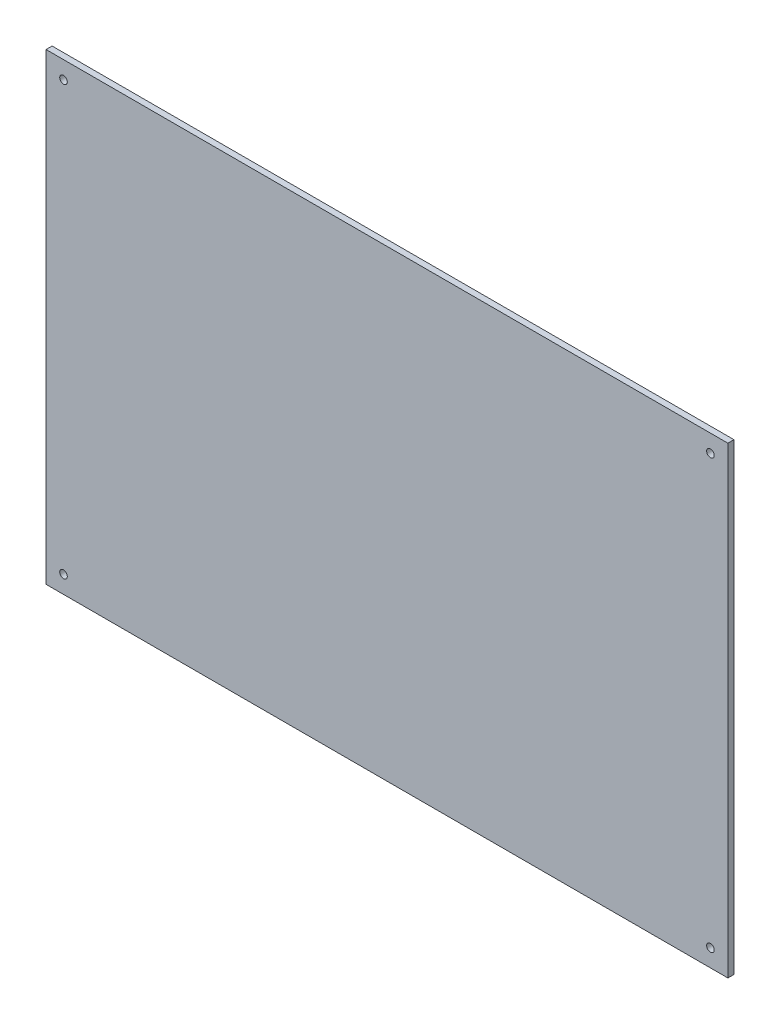
ISO-10303-21;
HEADER;
FILE_DESCRIPTION(('STEP AP214'),'2;1');
FILE_NAME('part.step','',(''),(''),'','','');
FILE_SCHEMA(('AUTOMOTIVE_DESIGN { 1 0 10303 214 1 1 1 1 }'));
ENDSEC;
DATA;
#1=APPLICATION_CONTEXT('core data for automotive mechanical design processes');
#2=APPLICATION_PROTOCOL_DEFINITION('international standard','automotive_design',2000,#1);
#3=PRODUCT_CONTEXT('',#1,'mechanical');
#4=PRODUCT('Part','Part','',(#3));
#5=PRODUCT_RELATED_PRODUCT_CATEGORY('part','',(#4));
#6=PRODUCT_DEFINITION_FORMATION('','',#4);
#7=PRODUCT_DEFINITION_CONTEXT('part definition',#1,'design');
#8=PRODUCT_DEFINITION('design','',#6,#7);
#9=PRODUCT_DEFINITION_SHAPE('','',#8);
#10=(LENGTH_UNIT() NAMED_UNIT(*) SI_UNIT(.MILLI.,.METRE.));
#11=(NAMED_UNIT(*) PLANE_ANGLE_UNIT() SI_UNIT($,.RADIAN.));
#12=(NAMED_UNIT(*) SI_UNIT($,.STERADIAN.) SOLID_ANGLE_UNIT());
#13=UNCERTAINTY_MEASURE_WITH_UNIT(LENGTH_MEASURE(1.E-05),#10,'distance_accuracy_value','');
#14=(GEOMETRIC_REPRESENTATION_CONTEXT(3) GLOBAL_UNCERTAINTY_ASSIGNED_CONTEXT((#13)) GLOBAL_UNIT_ASSIGNED_CONTEXT((#10,
#11,#12)) REPRESENTATION_CONTEXT('',''));
#15=CARTESIAN_POINT('',(0.,0.,0.));
#16=DIRECTION('',(0.,0.,1.));
#17=DIRECTION('',(1.,0.,0.));
#18=AXIS2_PLACEMENT_3D('',#15,#16,#17);
#19=CARTESIAN_POINT('',(0.,0.,4.));
#20=DIRECTION('',(0.,0.,1.));
#21=DIRECTION('',(1.,0.,0.));
#22=AXIS2_PLACEMENT_3D('',#19,#20,#21);
#23=PLANE('',#22);
#24=CARTESIAN_POINT('',(-11.5000000000001,293.5,4.));
#25=DIRECTION('',(0.,0.,1.));
#26=DIRECTION('',(-1.,0.,0.));
#27=AXIS2_PLACEMENT_3D('',#24,#25,#26);
#28=CIRCLE('',#27,2.50000000000002);
#29=CARTESIAN_POINT('',(-14.0000000000001,293.5,4.));
#30=VERTEX_POINT('',#29);
#31=EDGE_CURVE('E124',#30,#30,#28,.T.);
#32=ORIENTED_EDGE('',*,*,#31,.F.);
#33=EDGE_LOOP('',(#32));
#34=FACE_BOUND('',#33,.T.);
#35=CARTESIAN_POINT('',(-437.5,293.5,4.));
#36=DIRECTION('',(0.,0.,1.));
#37=DIRECTION('',(1.,0.,0.));
#38=AXIS2_PLACEMENT_3D('',#35,#36,#37);
#39=CIRCLE('',#38,2.50000000000002);
#40=CARTESIAN_POINT('',(-435.,293.5,4.));
#41=VERTEX_POINT('',#40);
#42=EDGE_CURVE('E103',#41,#41,#39,.T.);
#43=ORIENTED_EDGE('',*,*,#42,.F.);
#44=EDGE_LOOP('',(#43));
#45=FACE_BOUND('',#44,.T.);
#46=DIRECTION('',(0.,1.,0.));
#47=VECTOR('',#46,1.);
#48=CARTESIAN_POINT('',(0.,0.,4.));
#49=LINE('',#48,#47);
#50=CARTESIAN_POINT('',(0.,0.,4.));
#51=VERTEX_POINT('',#50);
#52=CARTESIAN_POINT('',(-1.11022302462516E-13,305.,4.));
#53=VERTEX_POINT('',#52);
#54=EDGE_CURVE('E88',#51,#53,#49,.T.);
#55=ORIENTED_EDGE('',*,*,#54,.T.);
#56=DIRECTION('',(-1.,0.,0.));
#57=VECTOR('',#56,1.);
#58=CARTESIAN_POINT('',(-1.11022302462516E-13,305.,4.));
#59=LINE('',#58,#57);
#60=CARTESIAN_POINT('',(-449.,305.,4.));
#61=VERTEX_POINT('',#60);
#62=EDGE_CURVE('E83',#53,#61,#59,.T.);
#63=ORIENTED_EDGE('',*,*,#62,.T.);
#64=DIRECTION('',(0.,-1.,0.));
#65=VECTOR('',#64,1.);
#66=CARTESIAN_POINT('',(-449.,0.,4.));
#67=LINE('',#66,#65);
#68=CARTESIAN_POINT('',(-449.,0.,4.));
#69=VERTEX_POINT('',#68);
#70=EDGE_CURVE('E86',#61,#69,#67,.T.);
#71=ORIENTED_EDGE('',*,*,#70,.T.);
#72=DIRECTION('',(1.,0.,0.));
#73=VECTOR('',#72,1.);
#74=CARTESIAN_POINT('',(0.,0.,4.));
#75=LINE('',#74,#73);
#76=EDGE_CURVE('E53',#69,#51,#75,.T.);
#77=ORIENTED_EDGE('',*,*,#76,.T.);
#78=EDGE_LOOP('',(#55,#63,#71,#77));
#79=FACE_BOUND('',#78,.T.);
#80=CARTESIAN_POINT('',(-437.5,11.5,4.));
#81=DIRECTION('',(0.,0.,1.));
#82=DIRECTION('',(-1.,0.,0.));
#83=AXIS2_PLACEMENT_3D('',#80,#81,#82);
#84=CIRCLE('',#83,2.50000000000002);
#85=CARTESIAN_POINT('',(-440.,11.5,4.));
#86=VERTEX_POINT('',#85);
#87=EDGE_CURVE('E118',#86,#86,#84,.T.);
#88=ORIENTED_EDGE('',*,*,#87,.F.);
#89=EDGE_LOOP('',(#88));
#90=FACE_BOUND('',#89,.T.);
#91=CARTESIAN_POINT('',(-11.5000000000001,11.5,4.));
#92=DIRECTION('',(0.,0.,1.));
#93=DIRECTION('',(1.,0.,0.));
#94=AXIS2_PLACEMENT_3D('',#91,#92,#93);
#95=CIRCLE('',#94,2.50000000000002);
#96=CARTESIAN_POINT('',(-9.00000000000005,11.5,4.));
#97=VERTEX_POINT('',#96);
#98=EDGE_CURVE('E130',#97,#97,#95,.T.);
#99=ORIENTED_EDGE('',*,*,#98,.F.);
#100=EDGE_LOOP('',(#99));
#101=FACE_BOUND('',#100,.T.);
#102=ADVANCED_FACE('F36',(#34,#45,#79,#90,#101),#23,.T.);
#103=CARTESIAN_POINT('',(0.,0.,0.));
#104=DIRECTION('',(0.,0.,1.));
#105=DIRECTION('',(1.,0.,0.));
#106=AXIS2_PLACEMENT_3D('',#103,#104,#105);
#107=PLANE('',#106);
#108=DIRECTION('',(0.,1.,0.));
#109=VECTOR('',#108,1.);
#110=CARTESIAN_POINT('',(0.,0.,0.));
#111=LINE('',#110,#109);
#112=CARTESIAN_POINT('',(0.,0.,0.));
#113=VERTEX_POINT('',#112);
#114=CARTESIAN_POINT('',(-1.11022302462516E-13,305.,0.));
#115=VERTEX_POINT('',#114);
#116=EDGE_CURVE('E100',#113,#115,#111,.T.);
#117=ORIENTED_EDGE('',*,*,#116,.F.);
#118=DIRECTION('',(1.,0.,0.));
#119=VECTOR('',#118,1.);
#120=CARTESIAN_POINT('',(0.,0.,0.));
#121=LINE('',#120,#119);
#122=CARTESIAN_POINT('',(-449.,0.,0.));
#123=VERTEX_POINT('',#122);
#124=EDGE_CURVE('E76',#123,#113,#121,.T.);
#125=ORIENTED_EDGE('',*,*,#124,.F.);
#126=DIRECTION('',(0.,-1.,0.));
#127=VECTOR('',#126,1.);
#128=CARTESIAN_POINT('',(-449.,0.,0.));
#129=LINE('',#128,#127);
#130=CARTESIAN_POINT('',(-449.,305.,0.));
#131=VERTEX_POINT('',#130);
#132=EDGE_CURVE('E70',#131,#123,#129,.T.);
#133=ORIENTED_EDGE('',*,*,#132,.F.);
#134=DIRECTION('',(-1.,0.,0.));
#135=VECTOR('',#134,1.);
#136=CARTESIAN_POINT('',(-1.11022302462516E-13,305.,0.));
#137=LINE('',#136,#135);
#138=EDGE_CURVE('E92',#115,#131,#137,.T.);
#139=ORIENTED_EDGE('',*,*,#138,.F.);
#140=EDGE_LOOP('',(#117,#125,#133,#139));
#141=FACE_BOUND('',#140,.T.);
#142=CARTESIAN_POINT('',(-437.5,293.5,0.));
#143=DIRECTION('',(0.,0.,1.));
#144=DIRECTION('',(1.,0.,0.));
#145=AXIS2_PLACEMENT_3D('',#142,#143,#144);
#146=CIRCLE('',#145,2.50000000000002);
#147=CARTESIAN_POINT('',(-435.,293.5,0.));
#148=VERTEX_POINT('',#147);
#149=EDGE_CURVE('E115',#148,#148,#146,.T.);
#150=ORIENTED_EDGE('',*,*,#149,.T.);
#151=EDGE_LOOP('',(#150));
#152=FACE_BOUND('',#151,.T.);
#153=CARTESIAN_POINT('',(-437.5,11.5,0.));
#154=DIRECTION('',(0.,0.,1.));
#155=DIRECTION('',(-1.,0.,0.));
#156=AXIS2_PLACEMENT_3D('',#153,#154,#155);
#157=CIRCLE('',#156,2.50000000000002);
#158=CARTESIAN_POINT('',(-440.,11.5,0.));
#159=VERTEX_POINT('',#158);
#160=EDGE_CURVE('E121',#159,#159,#157,.T.);
#161=ORIENTED_EDGE('',*,*,#160,.T.);
#162=EDGE_LOOP('',(#161));
#163=FACE_BOUND('',#162,.T.);
#164=CARTESIAN_POINT('',(-11.5000000000001,293.5,0.));
#165=DIRECTION('',(0.,0.,1.));
#166=DIRECTION('',(-1.,0.,0.));
#167=AXIS2_PLACEMENT_3D('',#164,#165,#166);
#168=CIRCLE('',#167,2.50000000000002);
#169=CARTESIAN_POINT('',(-14.0000000000001,293.5,0.));
#170=VERTEX_POINT('',#169);
#171=EDGE_CURVE('E127',#170,#170,#168,.T.);
#172=ORIENTED_EDGE('',*,*,#171,.T.);
#173=EDGE_LOOP('',(#172));
#174=FACE_BOUND('',#173,.T.);
#175=CARTESIAN_POINT('',(-11.5000000000001,11.5,0.));
#176=DIRECTION('',(0.,0.,1.));
#177=DIRECTION('',(1.,0.,0.));
#178=AXIS2_PLACEMENT_3D('',#175,#176,#177);
#179=CIRCLE('',#178,2.50000000000002);
#180=CARTESIAN_POINT('',(-9.00000000000005,11.5,0.));
#181=VERTEX_POINT('',#180);
#182=EDGE_CURVE('E133',#181,#181,#179,.T.);
#183=ORIENTED_EDGE('',*,*,#182,.T.);
#184=EDGE_LOOP('',(#183));
#185=FACE_BOUND('',#184,.T.);
#186=ADVANCED_FACE('F111',(#141,#152,#163,#174,#185),#107,.F.);
#187=CARTESIAN_POINT('',(0.,0.,4.));
#188=DIRECTION('',(-1.,0.,0.));
#189=DIRECTION('',(0.,-1.,0.));
#190=AXIS2_PLACEMENT_3D('',#187,#188,#189);
#191=PLANE('',#190);
#192=ORIENTED_EDGE('',*,*,#116,.T.);
#193=DIRECTION('',(0.,0.,-1.));
#194=VECTOR('',#193,1.);
#195=CARTESIAN_POINT('',(-1.11022302462516E-13,305.,4.));
#196=LINE('',#195,#194);
#197=EDGE_CURVE('E11',#53,#115,#196,.T.);
#198=ORIENTED_EDGE('',*,*,#197,.F.);
#199=ORIENTED_EDGE('',*,*,#54,.F.);
#200=DIRECTION('',(0.,0.,-1.));
#201=VECTOR('',#200,1.);
#202=CARTESIAN_POINT('',(0.,0.,4.));
#203=LINE('',#202,#201);
#204=EDGE_CURVE('E96',#51,#113,#203,.T.);
#205=ORIENTED_EDGE('',*,*,#204,.T.);
#206=EDGE_LOOP('',(#192,#198,#199,#205));
#207=FACE_BOUND('',#206,.T.);
#208=ADVANCED_FACE('F38',(#207),#191,.F.);
#209=CARTESIAN_POINT('',(-1.11022302462516E-13,305.,4.));
#210=DIRECTION('',(0.,-1.,0.));
#211=DIRECTION('',(1.,0.,0.));
#212=AXIS2_PLACEMENT_3D('',#209,#210,#211);
#213=PLANE('',#212);
#214=ORIENTED_EDGE('',*,*,#138,.T.);
#215=DIRECTION('',(0.,0.,-1.));
#216=VECTOR('',#215,1.);
#217=CARTESIAN_POINT('',(-449.,305.,4.));
#218=LINE('',#217,#216);
#219=EDGE_CURVE('E45',#61,#131,#218,.T.);
#220=ORIENTED_EDGE('',*,*,#219,.F.);
#221=ORIENTED_EDGE('',*,*,#62,.F.);
#222=ORIENTED_EDGE('',*,*,#197,.T.);
#223=EDGE_LOOP('',(#214,#220,#221,#222));
#224=FACE_BOUND('',#223,.T.);
#225=ADVANCED_FACE('F91',(#224),#213,.F.);
#226=CARTESIAN_POINT('',(-449.,0.,4.));
#227=DIRECTION('',(1.,0.,0.));
#228=DIRECTION('',(0.,1.,0.));
#229=AXIS2_PLACEMENT_3D('',#226,#227,#228);
#230=PLANE('',#229);
#231=ORIENTED_EDGE('',*,*,#132,.T.);
#232=DIRECTION('',(0.,0.,-1.));
#233=VECTOR('',#232,1.);
#234=CARTESIAN_POINT('',(-449.,0.,4.));
#235=LINE('',#234,#233);
#236=EDGE_CURVE('E93',#69,#123,#235,.T.);
#237=ORIENTED_EDGE('',*,*,#236,.F.);
#238=ORIENTED_EDGE('',*,*,#70,.F.);
#239=ORIENTED_EDGE('',*,*,#219,.T.);
#240=EDGE_LOOP('',(#231,#237,#238,#239));
#241=FACE_BOUND('',#240,.T.);
#242=ADVANCED_FACE('F94',(#241),#230,.F.);
#243=CARTESIAN_POINT('',(0.,0.,4.));
#244=DIRECTION('',(0.,1.,0.));
#245=DIRECTION('',(-1.,0.,0.));
#246=AXIS2_PLACEMENT_3D('',#243,#244,#245);
#247=PLANE('',#246);
#248=ORIENTED_EDGE('',*,*,#124,.T.);
#249=ORIENTED_EDGE('',*,*,#204,.F.);
#250=ORIENTED_EDGE('',*,*,#76,.F.);
#251=ORIENTED_EDGE('',*,*,#236,.T.);
#252=EDGE_LOOP('',(#248,#249,#250,#251));
#253=FACE_BOUND('',#252,.T.);
#254=ADVANCED_FACE('F108',(#253),#247,.F.);
#255=CARTESIAN_POINT('',(-437.5,293.5,4.));
#256=DIRECTION('',(0.,0.,-1.));
#257=DIRECTION('',(-1.,0.,0.));
#258=AXIS2_PLACEMENT_3D('',#255,#256,#257);
#259=CYLINDRICAL_SURFACE('',#258,2.50000000000002);
#260=ORIENTED_EDGE('',*,*,#42,.T.);
#261=EDGE_LOOP('',(#260));
#262=FACE_BOUND('',#261,.T.);
#263=ORIENTED_EDGE('',*,*,#149,.F.);
#264=EDGE_LOOP('',(#263));
#265=FACE_BOUND('',#264,.T.);
#266=ADVANCED_FACE('F152',(#262,#265),#259,.F.);
#267=CARTESIAN_POINT('',(-437.5,11.5,4.));
#268=DIRECTION('',(0.,0.,-1.));
#269=DIRECTION('',(-1.,0.,0.));
#270=AXIS2_PLACEMENT_3D('',#267,#268,#269);
#271=CYLINDRICAL_SURFACE('',#270,2.50000000000002);
#272=ORIENTED_EDGE('',*,*,#87,.T.);
#273=EDGE_LOOP('',(#272));
#274=FACE_BOUND('',#273,.T.);
#275=ORIENTED_EDGE('',*,*,#160,.F.);
#276=EDGE_LOOP('',(#275));
#277=FACE_BOUND('',#276,.T.);
#278=ADVANCED_FACE('F200',(#274,#277),#271,.F.);
#279=CARTESIAN_POINT('',(-11.5000000000001,293.5,4.));
#280=DIRECTION('',(0.,0.,-1.));
#281=DIRECTION('',(-1.,0.,0.));
#282=AXIS2_PLACEMENT_3D('',#279,#280,#281);
#283=CYLINDRICAL_SURFACE('',#282,2.50000000000002);
#284=ORIENTED_EDGE('',*,*,#31,.T.);
#285=EDGE_LOOP('',(#284));
#286=FACE_BOUND('',#285,.T.);
#287=ORIENTED_EDGE('',*,*,#171,.F.);
#288=EDGE_LOOP('',(#287));
#289=FACE_BOUND('',#288,.T.);
#290=ADVANCED_FACE('F208',(#286,#289),#283,.F.);
#291=CARTESIAN_POINT('',(-11.5000000000001,11.5,4.));
#292=DIRECTION('',(0.,0.,-1.));
#293=DIRECTION('',(-1.,0.,0.));
#294=AXIS2_PLACEMENT_3D('',#291,#292,#293);
#295=CYLINDRICAL_SURFACE('',#294,2.50000000000002);
#296=ORIENTED_EDGE('',*,*,#98,.T.);
#297=EDGE_LOOP('',(#296));
#298=FACE_BOUND('',#297,.T.);
#299=ORIENTED_EDGE('',*,*,#182,.F.);
#300=EDGE_LOOP('',(#299));
#301=FACE_BOUND('',#300,.T.);
#302=ADVANCED_FACE('F139',(#298,#301),#295,.F.);
#303=CLOSED_SHELL('',(#102,#186,#208,#225,#242,#254,#266,#278,#290,#302));
#304=MANIFOLD_SOLID_BREP('B2',#303);
#305=ADVANCED_BREP_SHAPE_REPRESENTATION('',(#18,#304),#14);
#306=SHAPE_DEFINITION_REPRESENTATION(#9,#305);
ENDSEC;
END-ISO-10303-21;
